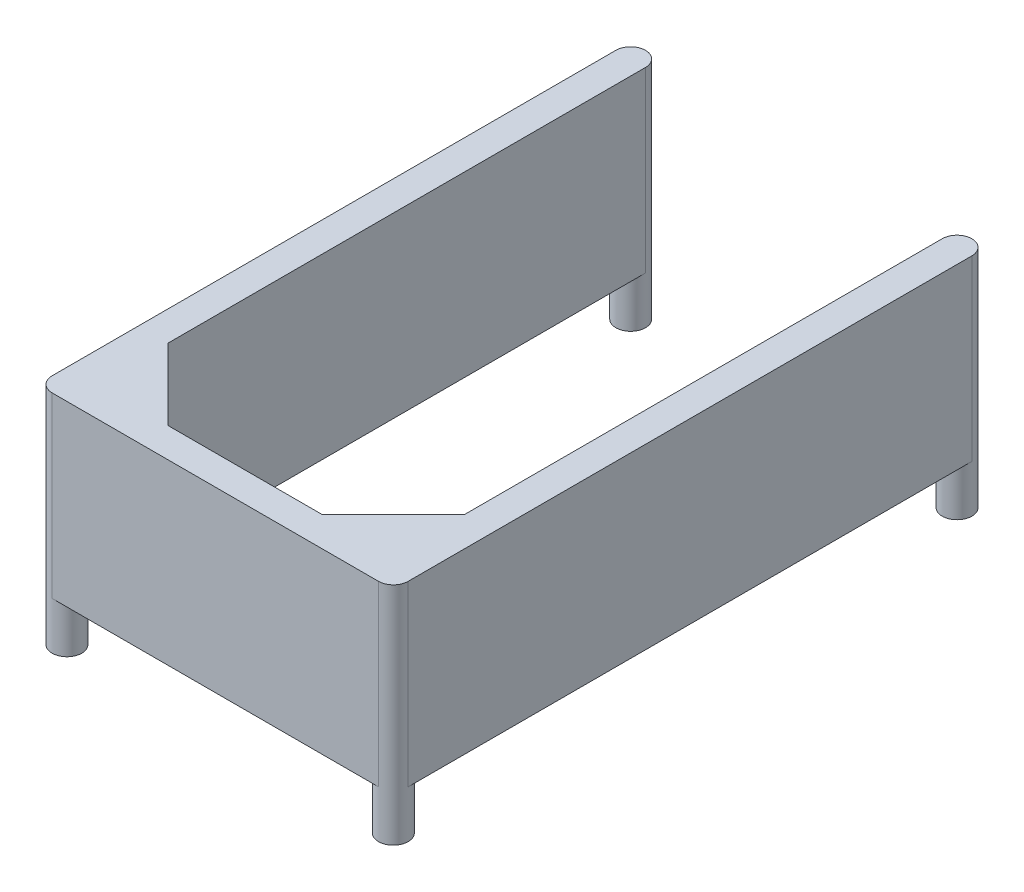
ISO-10303-21;
HEADER;
FILE_DESCRIPTION(('STEP AP214'),'2;1');
FILE_NAME('part.step','',(''),(''),'','','');
FILE_SCHEMA(('AUTOMOTIVE_DESIGN { 1 0 10303 214 1 1 1 1 }'));
ENDSEC;
DATA;
#1=APPLICATION_CONTEXT('core data for automotive mechanical design processes');
#2=APPLICATION_PROTOCOL_DEFINITION('international standard','automotive_design',2000,#1);
#3=PRODUCT_CONTEXT('',#1,'mechanical');
#4=PRODUCT('Part','Part','',(#3));
#5=PRODUCT_RELATED_PRODUCT_CATEGORY('part','',(#4));
#6=PRODUCT_DEFINITION_FORMATION('','',#4);
#7=PRODUCT_DEFINITION_CONTEXT('part definition',#1,'design');
#8=PRODUCT_DEFINITION('design','',#6,#7);
#9=PRODUCT_DEFINITION_SHAPE('','',#8);
#10=(LENGTH_UNIT() NAMED_UNIT(*) SI_UNIT(.MILLI.,.METRE.));
#11=(NAMED_UNIT(*) PLANE_ANGLE_UNIT() SI_UNIT($,.RADIAN.));
#12=(NAMED_UNIT(*) SI_UNIT($,.STERADIAN.) SOLID_ANGLE_UNIT());
#13=UNCERTAINTY_MEASURE_WITH_UNIT(LENGTH_MEASURE(1.E-05),#10,'distance_accuracy_value','');
#14=(GEOMETRIC_REPRESENTATION_CONTEXT(3) GLOBAL_UNCERTAINTY_ASSIGNED_CONTEXT((#13)) GLOBAL_UNIT_ASSIGNED_CONTEXT((#10,
#11,#12)) REPRESENTATION_CONTEXT('',''));
#15=CARTESIAN_POINT('',(0.,0.,0.));
#16=DIRECTION('',(0.,0.,1.));
#17=DIRECTION('',(1.,0.,0.));
#18=AXIS2_PLACEMENT_3D('',#15,#16,#17);
#19=CARTESIAN_POINT('',(0.,0.,0.));
#20=DIRECTION('',(0.,1.,0.));
#21=DIRECTION('',(0.,0.,1.));
#22=AXIS2_PLACEMENT_3D('',#19,#20,#21);
#23=PLANE('',#22);
#24=CARTESIAN_POINT('',(69.85,0.,0.));
#25=DIRECTION('',(0.,-1.,0.));
#26=DIRECTION('',(0.,0.,-1.));
#27=AXIS2_PLACEMENT_3D('',#24,#25,#26);
#28=CIRCLE('',#27,3.175);
#29=CARTESIAN_POINT('',(69.85,0.,3.175));
#30=VERTEX_POINT('',#29);
#31=CARTESIAN_POINT('',(73.025,0.,0.));
#32=VERTEX_POINT('',#31);
#33=EDGE_CURVE('E127',#30,#32,#28,.T.);
#34=ORIENTED_EDGE('',*,*,#33,.F.);
#35=DIRECTION('',(1.,0.,0.));
#36=VECTOR('',#35,1.);
#37=CARTESIAN_POINT('',(0.,0.,3.175));
#38=LINE('',#37,#36);
#39=CARTESIAN_POINT('',(0.,0.,3.175));
#40=VERTEX_POINT('',#39);
#41=EDGE_CURVE('E129',#40,#30,#38,.T.);
#42=ORIENTED_EDGE('',*,*,#41,.F.);
#43=CARTESIAN_POINT('',(0.,0.,0.));
#44=DIRECTION('',(0.,-1.,0.));
#45=DIRECTION('',(0.,0.,-1.));
#46=AXIS2_PLACEMENT_3D('',#43,#44,#45);
#47=CIRCLE('',#46,3.175);
#48=CARTESIAN_POINT('',(-3.175,0.,0.));
#49=VERTEX_POINT('',#48);
#50=EDGE_CURVE('E446',#49,#40,#47,.T.);
#51=ORIENTED_EDGE('',*,*,#50,.F.);
#52=DIRECTION('',(0.,0.,1.));
#53=VECTOR('',#52,1.);
#54=CARTESIAN_POINT('',(-3.175,0.,0.));
#55=LINE('',#54,#53);
#56=CARTESIAN_POINT('',(-3.175,0.,-120.65));
#57=VERTEX_POINT('',#56);
#58=EDGE_CURVE('E224',#57,#49,#55,.T.);
#59=ORIENTED_EDGE('',*,*,#58,.F.);
#60=CARTESIAN_POINT('',(0.,0.,-120.65));
#61=DIRECTION('',(0.,-1.,0.));
#62=DIRECTION('',(0.,0.,-1.));
#63=AXIS2_PLACEMENT_3D('',#60,#61,#62);
#64=CIRCLE('',#63,3.175);
#65=CARTESIAN_POINT('',(3.175,0.,-120.65));
#66=VERTEX_POINT('',#65);
#67=EDGE_CURVE('E454',#66,#57,#64,.T.);
#68=ORIENTED_EDGE('',*,*,#67,.F.);
#69=DIRECTION('',(0.,0.,-1.));
#70=VECTOR('',#69,1.);
#71=CARTESIAN_POINT('',(3.175,0.,-3.175));
#72=LINE('',#71,#70);
#73=CARTESIAN_POINT('',(3.175,0.,-18.4150000000001));
#74=VERTEX_POINT('',#73);
#75=EDGE_CURVE('E187',#74,#66,#72,.T.);
#76=ORIENTED_EDGE('',*,*,#75,.F.);
#77=DIRECTION('',(-0.707106781186544,0.,-0.707106781186551));
#78=VECTOR('',#77,1.);
#79=CARTESIAN_POINT('',(10.795,0.,-10.795));
#80=LINE('',#79,#78);
#81=CARTESIAN_POINT('',(18.4149999999999,0.,-3.175));
#82=VERTEX_POINT('',#81);
#83=EDGE_CURVE('E47',#74,#82,#80,.F.);
#84=ORIENTED_EDGE('',*,*,#83,.T.);
#85=DIRECTION('',(-1.,0.,0.));
#86=VECTOR('',#85,1.);
#87=CARTESIAN_POINT('',(3.175,0.,-3.175));
#88=LINE('',#87,#86);
#89=CARTESIAN_POINT('',(51.4349999999999,0.,-3.175));
#90=VERTEX_POINT('',#89);
#91=EDGE_CURVE('E185',#90,#82,#88,.T.);
#92=ORIENTED_EDGE('',*,*,#91,.F.);
#93=DIRECTION('',(-0.707106781186551,0.,0.707106781186544));
#94=VECTOR('',#93,1.);
#95=CARTESIAN_POINT('',(24.1299999999997,0.,24.1299999999999));
#96=LINE('',#95,#94);
#97=CARTESIAN_POINT('',(66.675,0.,-18.415));
#98=VERTEX_POINT('',#97);
#99=EDGE_CURVE('E176',#90,#98,#96,.F.);
#100=ORIENTED_EDGE('',*,*,#99,.T.);
#101=DIRECTION('',(0.,0.,1.));
#102=VECTOR('',#101,1.);
#103=CARTESIAN_POINT('',(66.675,0.,-3.175));
#104=LINE('',#103,#102);
#105=CARTESIAN_POINT('',(66.675,0.,-120.65));
#106=VERTEX_POINT('',#105);
#107=EDGE_CURVE('E193',#106,#98,#104,.T.);
#108=ORIENTED_EDGE('',*,*,#107,.F.);
#109=CARTESIAN_POINT('',(69.85,0.,-120.65));
#110=DIRECTION('',(0.,-1.,0.));
#111=DIRECTION('',(0.,0.,-1.));
#112=AXIS2_PLACEMENT_3D('',#109,#110,#111);
#113=CIRCLE('',#112,3.175);
#114=CARTESIAN_POINT('',(73.025,0.,-120.65));
#115=VERTEX_POINT('',#114);
#116=EDGE_CURVE('E249',#115,#106,#113,.T.);
#117=ORIENTED_EDGE('',*,*,#116,.F.);
#118=DIRECTION('',(0.,0.,-1.));
#119=VECTOR('',#118,1.);
#120=CARTESIAN_POINT('',(73.025,0.,0.));
#121=LINE('',#120,#119);
#122=EDGE_CURVE('E132',#32,#115,#121,.T.);
#123=ORIENTED_EDGE('',*,*,#122,.F.);
#124=EDGE_LOOP('',(#34,#42,#51,#59,#68,#76,#84,#92,#100,#108,#117,#123));
#125=FACE_BOUND('',#124,.T.);
#126=ADVANCED_FACE('F38',(#125),#23,.F.);
#127=CARTESIAN_POINT('',(0.,38.1,0.));
#128=DIRECTION('',(0.,-1.,0.));
#129=DIRECTION('',(0.,0.,-1.));
#130=AXIS2_PLACEMENT_3D('',#127,#128,#129);
#131=CYLINDRICAL_SURFACE('',#130,3.175);
#132=DIRECTION('',(0.,-1.,0.));
#133=VECTOR('',#132,1.);
#134=CARTESIAN_POINT('',(-3.175,38.1,0.));
#135=LINE('',#134,#133);
#136=CARTESIAN_POINT('',(-3.175,38.1,0.));
#137=VERTEX_POINT('',#136);
#138=EDGE_CURVE('E215',#137,#49,#135,.T.);
#139=ORIENTED_EDGE('',*,*,#138,.T.);
#140=ORIENTED_EDGE('',*,*,#50,.T.);
#141=DIRECTION('',(0.,-1.,0.));
#142=VECTOR('',#141,1.);
#143=CARTESIAN_POINT('',(0.,38.1,3.175));
#144=LINE('',#143,#142);
#145=CARTESIAN_POINT('',(0.,38.1,3.175));
#146=VERTEX_POINT('',#145);
#147=EDGE_CURVE('E146',#146,#40,#144,.T.);
#148=ORIENTED_EDGE('',*,*,#147,.F.);
#149=CARTESIAN_POINT('',(0.,38.1,0.));
#150=DIRECTION('',(0.,1.,0.));
#151=DIRECTION('',(0.,0.,1.));
#152=AXIS2_PLACEMENT_3D('',#149,#150,#151);
#153=CIRCLE('',#152,3.175);
#154=EDGE_CURVE('E228',#137,#146,#153,.T.);
#155=ORIENTED_EDGE('',*,*,#154,.F.);
#156=EDGE_LOOP('',(#139,#140,#148,#155));
#157=FACE_BOUND('',#156,.T.);
#158=CARTESIAN_POINT('',(0.,-10.16,0.));
#159=DIRECTION('',(0.,-1.,0.));
#160=DIRECTION('',(0.,0.,-1.));
#161=AXIS2_PLACEMENT_3D('',#158,#159,#160);
#162=CIRCLE('',#161,3.175);
#163=CARTESIAN_POINT('',(0.,-10.16,-3.175));
#164=VERTEX_POINT('',#163);
#165=EDGE_CURVE('E449',#164,#164,#162,.T.);
#166=ORIENTED_EDGE('',*,*,#165,.F.);
#167=EDGE_LOOP('',(#166));
#168=FACE_BOUND('',#167,.T.);
#169=ADVANCED_FACE('F284',(#157,#168),#131,.T.);
#170=CARTESIAN_POINT('',(0.,38.1,3.175));
#171=DIRECTION('',(0.,0.,-1.));
#172=DIRECTION('',(-1.,0.,0.));
#173=AXIS2_PLACEMENT_3D('',#170,#171,#172);
#174=PLANE('',#173);
#175=ORIENTED_EDGE('',*,*,#41,.T.);
#176=DIRECTION('',(0.,-1.,0.));
#177=VECTOR('',#176,1.);
#178=CARTESIAN_POINT('',(69.85,38.1,3.17499999999999));
#179=LINE('',#178,#177);
#180=CARTESIAN_POINT('',(69.85,38.1,3.17499999999999));
#181=VERTEX_POINT('',#180);
#182=EDGE_CURVE('E143',#181,#30,#179,.T.);
#183=ORIENTED_EDGE('',*,*,#182,.F.);
#184=DIRECTION('',(1.,0.,0.));
#185=VECTOR('',#184,1.);
#186=CARTESIAN_POINT('',(0.,38.1,3.175));
#187=LINE('',#186,#185);
#188=EDGE_CURVE('E260',#146,#181,#187,.T.);
#189=ORIENTED_EDGE('',*,*,#188,.F.);
#190=ORIENTED_EDGE('',*,*,#147,.T.);
#191=EDGE_LOOP('',(#175,#183,#189,#190));
#192=FACE_BOUND('',#191,.T.);
#193=ADVANCED_FACE('F142',(#192),#174,.F.);
#194=CARTESIAN_POINT('',(69.85,38.1,0.));
#195=DIRECTION('',(0.,-1.,0.));
#196=DIRECTION('',(0.,0.,-1.));
#197=AXIS2_PLACEMENT_3D('',#194,#195,#196);
#198=CYLINDRICAL_SURFACE('',#197,3.17499999999999);
#199=ORIENTED_EDGE('',*,*,#182,.T.);
#200=ORIENTED_EDGE('',*,*,#33,.T.);
#201=DIRECTION('',(0.,-1.,0.));
#202=VECTOR('',#201,1.);
#203=CARTESIAN_POINT('',(73.025,38.1,0.));
#204=LINE('',#203,#202);
#205=CARTESIAN_POINT('',(73.025,38.1,0.));
#206=VERTEX_POINT('',#205);
#207=EDGE_CURVE('E154',#206,#32,#204,.T.);
#208=ORIENTED_EDGE('',*,*,#207,.F.);
#209=CARTESIAN_POINT('',(69.85,38.1,0.));
#210=DIRECTION('',(0.,1.,0.));
#211=DIRECTION('',(0.,0.,1.));
#212=AXIS2_PLACEMENT_3D('',#209,#210,#211);
#213=CIRCLE('',#212,3.17499999999999);
#214=EDGE_CURVE('E152',#181,#206,#213,.T.);
#215=ORIENTED_EDGE('',*,*,#214,.F.);
#216=EDGE_LOOP('',(#199,#200,#208,#215));
#217=FACE_BOUND('',#216,.T.);
#218=CARTESIAN_POINT('',(69.85,-10.16,0.));
#219=DIRECTION('',(0.,-1.,0.));
#220=DIRECTION('',(0.,0.,-1.));
#221=AXIS2_PLACEMENT_3D('',#218,#219,#220);
#222=CIRCLE('',#221,3.175);
#223=CARTESIAN_POINT('',(69.85,-10.16,-3.175));
#224=VERTEX_POINT('',#223);
#225=EDGE_CURVE('E138',#224,#224,#222,.T.);
#226=ORIENTED_EDGE('',*,*,#225,.F.);
#227=EDGE_LOOP('',(#226));
#228=FACE_BOUND('',#227,.T.);
#229=ADVANCED_FACE('F150',(#217,#228),#198,.T.);
#230=CARTESIAN_POINT('',(73.025,38.1,0.));
#231=DIRECTION('',(-1.,0.,0.));
#232=DIRECTION('',(0.,0.,1.));
#233=AXIS2_PLACEMENT_3D('',#230,#231,#232);
#234=PLANE('',#233);
#235=ORIENTED_EDGE('',*,*,#122,.T.);
#236=DIRECTION('',(0.,-1.,0.));
#237=VECTOR('',#236,1.);
#238=CARTESIAN_POINT('',(73.025,38.1,-120.65));
#239=LINE('',#238,#237);
#240=CARTESIAN_POINT('',(73.025,38.1,-120.65));
#241=VERTEX_POINT('',#240);
#242=EDGE_CURVE('E160',#241,#115,#239,.T.);
#243=ORIENTED_EDGE('',*,*,#242,.F.);
#244=DIRECTION('',(0.,0.,-1.));
#245=VECTOR('',#244,1.);
#246=CARTESIAN_POINT('',(73.025,38.1,0.));
#247=LINE('',#246,#245);
#248=EDGE_CURVE('E254',#206,#241,#247,.T.);
#249=ORIENTED_EDGE('',*,*,#248,.F.);
#250=ORIENTED_EDGE('',*,*,#207,.T.);
#251=EDGE_LOOP('',(#235,#243,#249,#250));
#252=FACE_BOUND('',#251,.T.);
#253=ADVANCED_FACE('F253',(#252),#234,.F.);
#254=CARTESIAN_POINT('',(69.85,38.1,-120.65));
#255=DIRECTION('',(0.,-1.,0.));
#256=DIRECTION('',(0.,0.,-1.));
#257=AXIS2_PLACEMENT_3D('',#254,#255,#256);
#258=CYLINDRICAL_SURFACE('',#257,3.175);
#259=ORIENTED_EDGE('',*,*,#242,.T.);
#260=ORIENTED_EDGE('',*,*,#116,.T.);
#261=DIRECTION('',(0.,-1.,0.));
#262=VECTOR('',#261,1.);
#263=CARTESIAN_POINT('',(66.675,38.1,-120.65));
#264=LINE('',#263,#262);
#265=CARTESIAN_POINT('',(66.675,38.1,-120.65));
#266=VERTEX_POINT('',#265);
#267=EDGE_CURVE('E238',#266,#106,#264,.T.);
#268=ORIENTED_EDGE('',*,*,#267,.F.);
#269=CARTESIAN_POINT('',(69.85,38.1,-120.65));
#270=DIRECTION('',(0.,1.,0.));
#271=DIRECTION('',(0.,0.,1.));
#272=AXIS2_PLACEMENT_3D('',#269,#270,#271);
#273=CIRCLE('',#272,3.175);
#274=EDGE_CURVE('E250',#241,#266,#273,.T.);
#275=ORIENTED_EDGE('',*,*,#274,.F.);
#276=EDGE_LOOP('',(#259,#260,#268,#275));
#277=FACE_BOUND('',#276,.T.);
#278=CARTESIAN_POINT('',(69.85,-10.16,-120.65));
#279=DIRECTION('',(0.,-1.,0.));
#280=DIRECTION('',(0.,0.,-1.));
#281=AXIS2_PLACEMENT_3D('',#278,#279,#280);
#282=CIRCLE('',#281,3.175);
#283=CARTESIAN_POINT('',(69.85,-10.16,-123.825));
#284=VERTEX_POINT('',#283);
#285=EDGE_CURVE('E148',#284,#284,#282,.T.);
#286=ORIENTED_EDGE('',*,*,#285,.F.);
#287=EDGE_LOOP('',(#286));
#288=FACE_BOUND('',#287,.T.);
#289=ADVANCED_FACE('F246',(#277,#288),#258,.T.);
#290=CARTESIAN_POINT('',(66.675,38.1,-3.175));
#291=DIRECTION('',(1.,0.,0.));
#292=DIRECTION('',(0.,0.,-1.));
#293=AXIS2_PLACEMENT_3D('',#290,#291,#292);
#294=PLANE('',#293);
#295=ORIENTED_EDGE('',*,*,#107,.T.);
#296=DIRECTION('',(0.,1.,0.));
#297=VECTOR('',#296,1.);
#298=CARTESIAN_POINT('',(66.675,38.1,-18.415));
#299=LINE('',#298,#297);
#300=CARTESIAN_POINT('',(66.675,38.1,-18.415));
#301=VERTEX_POINT('',#300);
#302=EDGE_CURVE('E170',#98,#301,#299,.T.);
#303=ORIENTED_EDGE('',*,*,#302,.T.);
#304=DIRECTION('',(0.,0.,1.));
#305=VECTOR('',#304,1.);
#306=CARTESIAN_POINT('',(66.675,38.1,-3.175));
#307=LINE('',#306,#305);
#308=EDGE_CURVE('E210',#266,#301,#307,.T.);
#309=ORIENTED_EDGE('',*,*,#308,.F.);
#310=ORIENTED_EDGE('',*,*,#267,.T.);
#311=EDGE_LOOP('',(#295,#303,#309,#310));
#312=FACE_BOUND('',#311,.T.);
#313=ADVANCED_FACE('F274',(#312),#294,.F.);
#314=CARTESIAN_POINT('',(3.175,38.1,-3.175));
#315=DIRECTION('',(0.,0.,1.));
#316=DIRECTION('',(1.,0.,0.));
#317=AXIS2_PLACEMENT_3D('',#314,#315,#316);
#318=PLANE('',#317);
#319=DIRECTION('',(-1.,0.,0.));
#320=VECTOR('',#319,1.);
#321=CARTESIAN_POINT('',(3.175,38.1,-3.175));
#322=LINE('',#321,#320);
#323=CARTESIAN_POINT('',(51.4349999999999,38.1,-3.175));
#324=VERTEX_POINT('',#323);
#325=CARTESIAN_POINT('',(18.4149999999999,38.1,-3.175));
#326=VERTEX_POINT('',#325);
#327=EDGE_CURVE('E204',#324,#326,#322,.T.);
#328=ORIENTED_EDGE('',*,*,#327,.F.);
#329=DIRECTION('',(0.,-1.,0.));
#330=VECTOR('',#329,1.);
#331=CARTESIAN_POINT('',(51.4349999999999,0.,-3.175));
#332=LINE('',#331,#330);
#333=EDGE_CURVE('E166',#324,#90,#332,.T.);
#334=ORIENTED_EDGE('',*,*,#333,.T.);
#335=ORIENTED_EDGE('',*,*,#91,.T.);
#336=DIRECTION('',(0.,1.,0.));
#337=VECTOR('',#336,1.);
#338=CARTESIAN_POINT('',(18.4149999999999,38.1,-3.175));
#339=LINE('',#338,#337);
#340=EDGE_CURVE('E158',#82,#326,#339,.T.);
#341=ORIENTED_EDGE('',*,*,#340,.T.);
#342=EDGE_LOOP('',(#328,#334,#335,#341));
#343=FACE_BOUND('',#342,.T.);
#344=ADVANCED_FACE('F190',(#343),#318,.F.);
#345=CARTESIAN_POINT('',(3.175,38.1,-3.175));
#346=DIRECTION('',(-1.,0.,0.));
#347=DIRECTION('',(0.,0.,1.));
#348=AXIS2_PLACEMENT_3D('',#345,#346,#347);
#349=PLANE('',#348);
#350=DIRECTION('',(0.,0.,-1.));
#351=VECTOR('',#350,1.);
#352=CARTESIAN_POINT('',(3.175,38.1,-3.175));
#353=LINE('',#352,#351);
#354=CARTESIAN_POINT('',(3.175,38.1,-18.4150000000001));
#355=VERTEX_POINT('',#354);
#356=CARTESIAN_POINT('',(3.175,38.1,-120.65));
#357=VERTEX_POINT('',#356);
#358=EDGE_CURVE('E198',#355,#357,#353,.T.);
#359=ORIENTED_EDGE('',*,*,#358,.F.);
#360=DIRECTION('',(0.,-1.,0.));
#361=VECTOR('',#360,1.);
#362=CARTESIAN_POINT('',(3.175,0.,-18.4150000000001));
#363=LINE('',#362,#361);
#364=EDGE_CURVE('E173',#355,#74,#363,.T.);
#365=ORIENTED_EDGE('',*,*,#364,.T.);
#366=ORIENTED_EDGE('',*,*,#75,.T.);
#367=DIRECTION('',(0.,-1.,0.));
#368=VECTOR('',#367,1.);
#369=CARTESIAN_POINT('',(3.175,38.1,-120.65));
#370=LINE('',#369,#368);
#371=EDGE_CURVE('E200',#357,#66,#370,.T.);
#372=ORIENTED_EDGE('',*,*,#371,.F.);
#373=EDGE_LOOP('',(#359,#365,#366,#372));
#374=FACE_BOUND('',#373,.T.);
#375=ADVANCED_FACE('F196',(#374),#349,.F.);
#376=CARTESIAN_POINT('',(0.,38.1,-120.65));
#377=DIRECTION('',(0.,-1.,0.));
#378=DIRECTION('',(0.,0.,-1.));
#379=AXIS2_PLACEMENT_3D('',#376,#377,#378);
#380=CYLINDRICAL_SURFACE('',#379,3.175);
#381=ORIENTED_EDGE('',*,*,#371,.T.);
#382=ORIENTED_EDGE('',*,*,#67,.T.);
#383=DIRECTION('',(0.,-1.,0.));
#384=VECTOR('',#383,1.);
#385=CARTESIAN_POINT('',(-3.175,38.1,-120.65));
#386=LINE('',#385,#384);
#387=CARTESIAN_POINT('',(-3.175,38.1,-120.65));
#388=VERTEX_POINT('',#387);
#389=EDGE_CURVE('E232',#388,#57,#386,.T.);
#390=ORIENTED_EDGE('',*,*,#389,.F.);
#391=CARTESIAN_POINT('',(0.,38.1,-120.65));
#392=DIRECTION('',(0.,1.,0.));
#393=DIRECTION('',(0.,0.,1.));
#394=AXIS2_PLACEMENT_3D('',#391,#392,#393);
#395=CIRCLE('',#394,3.175);
#396=EDGE_CURVE('E203',#357,#388,#395,.T.);
#397=ORIENTED_EDGE('',*,*,#396,.F.);
#398=EDGE_LOOP('',(#381,#382,#390,#397));
#399=FACE_BOUND('',#398,.T.);
#400=CARTESIAN_POINT('',(0.,-10.16,-120.65));
#401=DIRECTION('',(0.,-1.,0.));
#402=DIRECTION('',(0.,0.,-1.));
#403=AXIS2_PLACEMENT_3D('',#400,#401,#402);
#404=CIRCLE('',#403,3.175);
#405=CARTESIAN_POINT('',(0.,-10.16,-123.825));
#406=VERTEX_POINT('',#405);
#407=EDGE_CURVE('E456',#406,#406,#404,.T.);
#408=ORIENTED_EDGE('',*,*,#407,.F.);
#409=EDGE_LOOP('',(#408));
#410=FACE_BOUND('',#409,.T.);
#411=ADVANCED_FACE('F297',(#399,#410),#380,.T.);
#412=CARTESIAN_POINT('',(-3.175,38.1,0.));
#413=DIRECTION('',(1.,0.,0.));
#414=DIRECTION('',(0.,0.,-1.));
#415=AXIS2_PLACEMENT_3D('',#412,#413,#414);
#416=PLANE('',#415);
#417=ORIENTED_EDGE('',*,*,#58,.T.);
#418=ORIENTED_EDGE('',*,*,#138,.F.);
#419=DIRECTION('',(0.,0.,1.));
#420=VECTOR('',#419,1.);
#421=CARTESIAN_POINT('',(-3.175,38.1,0.));
#422=LINE('',#421,#420);
#423=EDGE_CURVE('E208',#388,#137,#422,.T.);
#424=ORIENTED_EDGE('',*,*,#423,.F.);
#425=ORIENTED_EDGE('',*,*,#389,.T.);
#426=EDGE_LOOP('',(#417,#418,#424,#425));
#427=FACE_BOUND('',#426,.T.);
#428=ADVANCED_FACE('F294',(#427),#416,.F.);
#429=CARTESIAN_POINT('',(0.,38.1,0.));
#430=DIRECTION('',(0.,1.,0.));
#431=DIRECTION('',(0.,0.,1.));
#432=AXIS2_PLACEMENT_3D('',#429,#430,#431);
#433=PLANE('',#432);
#434=ORIENTED_EDGE('',*,*,#154,.T.);
#435=ORIENTED_EDGE('',*,*,#188,.T.);
#436=ORIENTED_EDGE('',*,*,#214,.T.);
#437=ORIENTED_EDGE('',*,*,#248,.T.);
#438=ORIENTED_EDGE('',*,*,#274,.T.);
#439=ORIENTED_EDGE('',*,*,#308,.T.);
#440=DIRECTION('',(0.707106781186551,0.,-0.707106781186544));
#441=VECTOR('',#440,1.);
#442=CARTESIAN_POINT('',(51.4349999999999,38.1,-3.175));
#443=LINE('',#442,#441);
#444=EDGE_CURVE('E179',#301,#324,#443,.F.);
#445=ORIENTED_EDGE('',*,*,#444,.T.);
#446=ORIENTED_EDGE('',*,*,#327,.T.);
#447=DIRECTION('',(0.707106781186544,0.,0.707106781186551));
#448=VECTOR('',#447,1.);
#449=CARTESIAN_POINT('',(3.175,38.1,-18.4150000000001));
#450=LINE('',#449,#448);
#451=EDGE_CURVE('E11',#326,#355,#450,.F.);
#452=ORIENTED_EDGE('',*,*,#451,.T.);
#453=ORIENTED_EDGE('',*,*,#358,.T.);
#454=ORIENTED_EDGE('',*,*,#396,.T.);
#455=ORIENTED_EDGE('',*,*,#423,.T.);
#456=EDGE_LOOP('',(#434,#435,#436,#437,#438,#439,#445,#446,#452,#453,#454,#455));
#457=FACE_BOUND('',#456,.T.);
#458=ADVANCED_FACE('F268',(#457),#433,.T.);
#459=CARTESIAN_POINT('',(69.85,-10.16,-120.65));
#460=DIRECTION('',(0.,-1.,0.));
#461=DIRECTION('',(0.,0.,-1.));
#462=AXIS2_PLACEMENT_3D('',#459,#460,#461);
#463=PLANE('',#462);
#464=ORIENTED_EDGE('',*,*,#285,.T.);
#465=EDGE_LOOP('',(#464));
#466=FACE_BOUND('',#465,.T.);
#467=ADVANCED_FACE('F323',(#466),#463,.T.);
#468=CARTESIAN_POINT('',(0.,-10.16,-120.65));
#469=DIRECTION('',(0.,-1.,0.));
#470=DIRECTION('',(0.,0.,-1.));
#471=AXIS2_PLACEMENT_3D('',#468,#469,#470);
#472=PLANE('',#471);
#473=ORIENTED_EDGE('',*,*,#407,.T.);
#474=EDGE_LOOP('',(#473));
#475=FACE_BOUND('',#474,.T.);
#476=ADVANCED_FACE('F329',(#475),#472,.T.);
#477=CARTESIAN_POINT('',(0.,-10.16,0.));
#478=DIRECTION('',(0.,-1.,0.));
#479=DIRECTION('',(0.,0.,-1.));
#480=AXIS2_PLACEMENT_3D('',#477,#478,#479);
#481=PLANE('',#480);
#482=ORIENTED_EDGE('',*,*,#165,.T.);
#483=EDGE_LOOP('',(#482));
#484=FACE_BOUND('',#483,.T.);
#485=ADVANCED_FACE('F336',(#484),#481,.T.);
#486=CARTESIAN_POINT('',(69.85,-10.16,0.));
#487=DIRECTION('',(0.,-1.,0.));
#488=DIRECTION('',(0.,0.,-1.));
#489=AXIS2_PLACEMENT_3D('',#486,#487,#488);
#490=PLANE('',#489);
#491=ORIENTED_EDGE('',*,*,#225,.T.);
#492=EDGE_LOOP('',(#491));
#493=FACE_BOUND('',#492,.T.);
#494=ADVANCED_FACE('F344',(#493),#490,.T.);
#495=CARTESIAN_POINT('',(51.4349999999999,38.1,-3.175));
#496=DIRECTION('',(-0.707106781186544,0.,-0.707106781186551));
#497=DIRECTION('',(0.,1.,0.));
#498=AXIS2_PLACEMENT_3D('',#495,#496,#497);
#499=PLANE('',#498);
#500=ORIENTED_EDGE('',*,*,#444,.F.);
#501=ORIENTED_EDGE('',*,*,#302,.F.);
#502=ORIENTED_EDGE('',*,*,#99,.F.);
#503=ORIENTED_EDGE('',*,*,#333,.F.);
#504=EDGE_LOOP('',(#500,#501,#502,#503));
#505=FACE_BOUND('',#504,.T.);
#506=ADVANCED_FACE('F272',(#505),#499,.T.);
#507=CARTESIAN_POINT('',(3.175,38.1,-18.4150000000001));
#508=DIRECTION('',(0.707106781186551,0.,-0.707106781186544));
#509=DIRECTION('',(0.,1.,0.));
#510=AXIS2_PLACEMENT_3D('',#507,#508,#509);
#511=PLANE('',#510);
#512=ORIENTED_EDGE('',*,*,#451,.F.);
#513=ORIENTED_EDGE('',*,*,#340,.F.);
#514=ORIENTED_EDGE('',*,*,#83,.F.);
#515=ORIENTED_EDGE('',*,*,#364,.F.);
#516=EDGE_LOOP('',(#512,#513,#514,#515));
#517=FACE_BOUND('',#516,.T.);
#518=ADVANCED_FACE('F40',(#517),#511,.T.);
#519=CLOSED_SHELL('',(#126,#169,#193,#229,#253,#289,#313,#344,#375,#411,#428,#458,#467,#476,
#485,#494,#506,#518));
#520=MANIFOLD_SOLID_BREP('B2',#519);
#521=ADVANCED_BREP_SHAPE_REPRESENTATION('',(#18,#520),#14);
#522=SHAPE_DEFINITION_REPRESENTATION(#9,#521);
ENDSEC;
END-ISO-10303-21;
